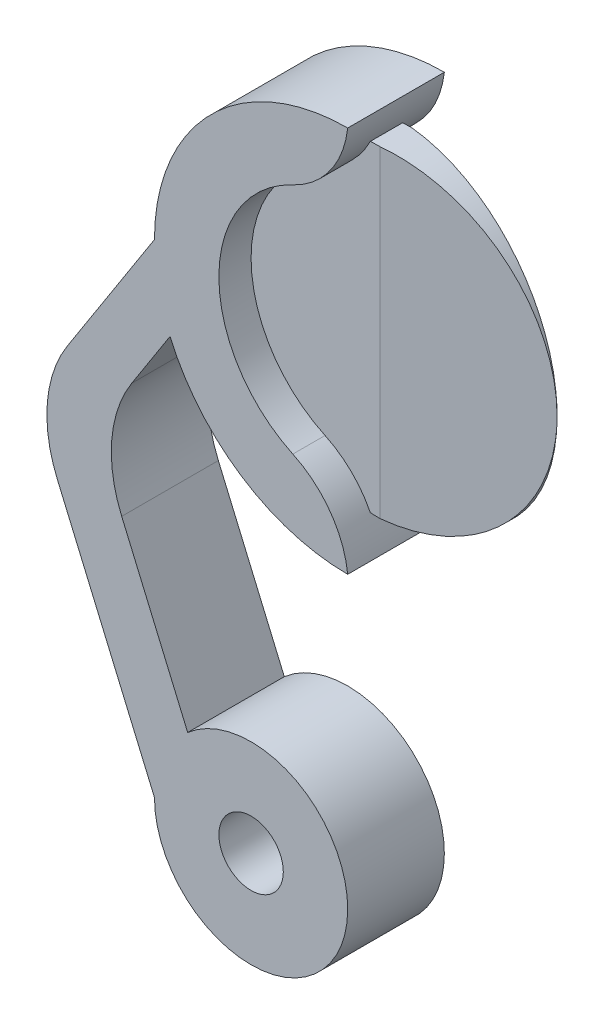
ISO-10303-21;
HEADER;
FILE_DESCRIPTION(('STEP AP214'),'2;1');
FILE_NAME('part.step','',(''),(''),'','','');
FILE_SCHEMA(('AUTOMOTIVE_DESIGN { 1 0 10303 214 1 1 1 1 }'));
ENDSEC;
DATA;
#1=APPLICATION_CONTEXT('core data for automotive mechanical design processes');
#2=APPLICATION_PROTOCOL_DEFINITION('international standard','automotive_design',2000,#1);
#3=PRODUCT_CONTEXT('',#1,'mechanical');
#4=PRODUCT('Part','Part','',(#3));
#5=PRODUCT_RELATED_PRODUCT_CATEGORY('part','',(#4));
#6=PRODUCT_DEFINITION_FORMATION('','',#4);
#7=PRODUCT_DEFINITION_CONTEXT('part definition',#1,'design');
#8=PRODUCT_DEFINITION('design','',#6,#7);
#9=PRODUCT_DEFINITION_SHAPE('','',#8);
#10=(LENGTH_UNIT() NAMED_UNIT(*) SI_UNIT(.MILLI.,.METRE.));
#11=(NAMED_UNIT(*) PLANE_ANGLE_UNIT() SI_UNIT($,.RADIAN.));
#12=(NAMED_UNIT(*) SI_UNIT($,.STERADIAN.) SOLID_ANGLE_UNIT());
#13=UNCERTAINTY_MEASURE_WITH_UNIT(LENGTH_MEASURE(1.E-05),#10,'distance_accuracy_value','');
#14=(GEOMETRIC_REPRESENTATION_CONTEXT(3) GLOBAL_UNCERTAINTY_ASSIGNED_CONTEXT((#13)) GLOBAL_UNIT_ASSIGNED_CONTEXT((#10,
#11,#12)) REPRESENTATION_CONTEXT('',''));
#15=CARTESIAN_POINT('',(0.,0.,0.));
#16=DIRECTION('',(0.,0.,1.));
#17=DIRECTION('',(1.,0.,0.));
#18=AXIS2_PLACEMENT_3D('',#15,#16,#17);
#19=CARTESIAN_POINT('',(0.,-30.,10.));
#20=DIRECTION('',(0.,0.,-1.));
#21=DIRECTION('',(0.,1.,0.));
#22=AXIS2_PLACEMENT_3D('',#19,#20,#21);
#23=CYLINDRICAL_SURFACE('',#22,25.);
#24=CARTESIAN_POINT('',(0.,-30.,5.));
#25=DIRECTION('',(0.099503719020999,0.,-0.995037190209989));
#26=DIRECTION('',(-0.995037190209989,0.,-0.099503719020999));
#27=AXIS2_PLACEMENT_3D('',#24,#25,#26);
#28=ELLIPSE('',#27,25.1246890528022,25.);
#29=CARTESIAN_POINT('',(0.,-55.,5.));
#30=VERTEX_POINT('',#29);
#31=CARTESIAN_POINT('',(25.,-30.,7.5));
#32=VERTEX_POINT('',#31);
#33=EDGE_CURVE('E12',#30,#32,#28,.F.);
#34=ORIENTED_EDGE('',*,*,#33,.T.);
#35=CARTESIAN_POINT('',(0.,-30.,10.));
#36=DIRECTION('',(0.0995037190209988,0.,0.995037190209989));
#37=DIRECTION('',(0.995037190209989,0.,-0.0995037190209988));
#38=AXIS2_PLACEMENT_3D('',#35,#36,#37);
#39=ELLIPSE('',#38,25.1246890528022,25.);
#40=CARTESIAN_POINT('',(0.,-55.,9.99999999999999));
#41=VERTEX_POINT('',#40);
#42=EDGE_CURVE('E239',#32,#41,#39,.F.);
#43=ORIENTED_EDGE('',*,*,#42,.T.);
#44=CARTESIAN_POINT('',(0.,-30.,10.));
#45=DIRECTION('',(0.,0.,-1.));
#46=DIRECTION('',(0.,1.,0.));
#47=AXIS2_PLACEMENT_3D('',#44,#45,#46);
#48=CIRCLE('',#47,25.);
#49=CARTESIAN_POINT('',(-1.492231190354,-54.9554251832048,9.99999999999999));
#50=VERTEX_POINT('',#49);
#51=EDGE_CURVE('E268',#41,#50,#48,.T.);
#52=ORIENTED_EDGE('',*,*,#51,.T.);
#53=DIRECTION('',(0.,0.,-1.));
#54=VECTOR('',#53,1.);
#55=CARTESIAN_POINT('',(-1.492231190354,-54.9554251832048,9.99999999999999));
#56=LINE('',#55,#54);
#57=CARTESIAN_POINT('',(-1.492231190354,-54.9554251832048,5.));
#58=VERTEX_POINT('',#57);
#59=EDGE_CURVE('E263',#50,#58,#56,.T.);
#60=ORIENTED_EDGE('',*,*,#59,.T.);
#61=CARTESIAN_POINT('',(0.,-30.,5.));
#62=DIRECTION('',(0.,0.,-1.));
#63=DIRECTION('',(0.,1.,0.));
#64=AXIS2_PLACEMENT_3D('',#61,#62,#63);
#65=CIRCLE('',#64,25.);
#66=EDGE_CURVE('E261',#30,#58,#65,.T.);
#67=ORIENTED_EDGE('',*,*,#66,.F.);
#68=EDGE_LOOP('',(#34,#43,#52,#60,#67));
#69=FACE_BOUND('',#68,.T.);
#70=ADVANCED_FACE('F100',(#69),#23,.T.);
#71=CARTESIAN_POINT('',(-1.492231190354,-5.04457481679515,10.));
#72=VERTEX_POINT('',#71);
#73=CARTESIAN_POINT('',(0.,-5.,10.));
#74=VERTEX_POINT('',#73);
#75=EDGE_CURVE('E253',#72,#74,#48,.T.);
#76=ORIENTED_EDGE('',*,*,#75,.T.);
#77=EDGE_CURVE('E115',#74,#32,#39,.F.);
#78=ORIENTED_EDGE('',*,*,#77,.T.);
#79=CARTESIAN_POINT('',(0.,-5.,5.));
#80=VERTEX_POINT('',#79);
#81=EDGE_CURVE('E108',#32,#80,#28,.F.);
#82=ORIENTED_EDGE('',*,*,#81,.T.);
#83=CARTESIAN_POINT('',(-1.492231190354,-5.04457481679515,5.));
#84=VERTEX_POINT('',#83);
#85=EDGE_CURVE('E266',#84,#80,#65,.T.);
#86=ORIENTED_EDGE('',*,*,#85,.F.);
#87=DIRECTION('',(0.,0.,-1.));
#88=VECTOR('',#87,1.);
#89=CARTESIAN_POINT('',(-1.492231190354,-5.04457481679515,10.));
#90=LINE('',#89,#88);
#91=EDGE_CURVE('E272',#72,#84,#90,.T.);
#92=ORIENTED_EDGE('',*,*,#91,.F.);
#93=EDGE_LOOP('',(#76,#78,#82,#86,#92));
#94=FACE_BOUND('',#93,.T.);
#95=ADVANCED_FACE('F249',(#94),#23,.T.);
#96=CARTESIAN_POINT('',(-21.,0.,10.));
#97=DIRECTION('',(0.,0.,1.));
#98=DIRECTION('',(0.,-1.,0.));
#99=AXIS2_PLACEMENT_3D('',#96,#97,#98);
#100=PLANE('',#99);
#101=ORIENTED_EDGE('',*,*,#51,.F.);
#102=DIRECTION('',(0.,1.,0.));
#103=VECTOR('',#102,1.);
#104=CARTESIAN_POINT('',(0.,-62.,9.99999999999999));
#105=LINE('',#104,#103);
#106=EDGE_CURVE('E241',#41,#74,#105,.T.);
#107=ORIENTED_EDGE('',*,*,#106,.T.);
#108=ORIENTED_EDGE('',*,*,#75,.F.);
#109=CARTESIAN_POINT('',(-14.9071198499986,1.66666666666667,10.));
#110=DIRECTION('',(0.,0.,1.));
#111=DIRECTION('',(0.,-1.,0.));
#112=AXIS2_PLACEMENT_3D('',#109,#110,#111);
#113=CIRCLE('',#112,15.);
#114=CARTESIAN_POINT('',(-8.5183541999992,-11.9047619047619,10.));
#115=VERTEX_POINT('',#114);
#116=EDGE_CURVE('E258',#72,#115,#113,.F.);
#117=ORIENTED_EDGE('',*,*,#116,.T.);
#118=CARTESIAN_POINT('',(0.,-30.,10.));
#119=DIRECTION('',(0.,0.,1.));
#120=DIRECTION('',(0.,-1.,0.));
#121=AXIS2_PLACEMENT_3D('',#118,#119,#120);
#122=CIRCLE('',#121,20.);
#123=CARTESIAN_POINT('',(-8.5183541999992,-48.0952380952381,9.99999999999999));
#124=VERTEX_POINT('',#123);
#125=EDGE_CURVE('E279',#115,#124,#122,.T.);
#126=ORIENTED_EDGE('',*,*,#125,.T.);
#127=CARTESIAN_POINT('',(-14.9071198499986,-61.6666666666667,9.99999999999999));
#128=DIRECTION('',(0.,0.,1.));
#129=DIRECTION('',(0.,-1.,0.));
#130=AXIS2_PLACEMENT_3D('',#127,#128,#129);
#131=CIRCLE('',#130,15.);
#132=EDGE_CURVE('E282',#124,#50,#131,.F.);
#133=ORIENTED_EDGE('',*,*,#132,.T.);
#134=EDGE_LOOP('',(#101,#107,#108,#117,#126,#133));
#135=FACE_BOUND('',#134,.T.);
#136=ADVANCED_FACE('F393',(#135),#100,.T.);
#137=CARTESIAN_POINT('',(-21.,0.,5.));
#138=DIRECTION('',(0.,0.,-1.));
#139=DIRECTION('',(0.,1.,0.));
#140=AXIS2_PLACEMENT_3D('',#137,#138,#139);
#141=PLANE('',#140);
#142=ORIENTED_EDGE('',*,*,#85,.T.);
#143=DIRECTION('',(0.,1.,0.));
#144=VECTOR('',#143,1.);
#145=CARTESIAN_POINT('',(0.,-62.,5.));
#146=LINE('',#145,#144);
#147=EDGE_CURVE('E244',#30,#80,#146,.T.);
#148=ORIENTED_EDGE('',*,*,#147,.F.);
#149=ORIENTED_EDGE('',*,*,#66,.T.);
#150=CARTESIAN_POINT('',(-14.9071198499986,-61.6666666666667,4.99999999999999));
#151=DIRECTION('',(0.,0.,-1.));
#152=DIRECTION('',(0.,1.,0.));
#153=AXIS2_PLACEMENT_3D('',#150,#151,#152);
#154=CIRCLE('',#153,15.);
#155=CARTESIAN_POINT('',(-8.5183541999992,-48.0952380952381,5.));
#156=VERTEX_POINT('',#155);
#157=EDGE_CURVE('E277',#58,#156,#154,.F.);
#158=ORIENTED_EDGE('',*,*,#157,.T.);
#159=CARTESIAN_POINT('',(0.,-30.,5.));
#160=DIRECTION('',(0.,0.,-1.));
#161=DIRECTION('',(0.,1.,0.));
#162=AXIS2_PLACEMENT_3D('',#159,#160,#161);
#163=CIRCLE('',#162,20.);
#164=CARTESIAN_POINT('',(-8.5183541999992,-11.9047619047619,5.));
#165=VERTEX_POINT('',#164);
#166=EDGE_CURVE('E274',#156,#165,#163,.T.);
#167=ORIENTED_EDGE('',*,*,#166,.T.);
#168=CARTESIAN_POINT('',(-14.9071198499986,1.66666666666667,5.));
#169=DIRECTION('',(0.,0.,-1.));
#170=DIRECTION('',(0.,1.,0.));
#171=AXIS2_PLACEMENT_3D('',#168,#169,#170);
#172=CIRCLE('',#171,15.);
#173=EDGE_CURVE('E388',#165,#84,#172,.F.);
#174=ORIENTED_EDGE('',*,*,#173,.T.);
#175=EDGE_LOOP('',(#142,#148,#149,#158,#167,#174));
#176=FACE_BOUND('',#175,.T.);
#177=ADVANCED_FACE('F451',(#176),#141,.T.);
#178=CARTESIAN_POINT('',(0.,-30.,15.));
#179=DIRECTION('',(0.,0.,-1.));
#180=DIRECTION('',(-1.,0.,0.));
#181=AXIS2_PLACEMENT_3D('',#178,#179,#180);
#182=CYLINDRICAL_SURFACE('',#181,20.);
#183=ORIENTED_EDGE('',*,*,#125,.F.);
#184=DIRECTION('',(0.,0.,-1.));
#185=VECTOR('',#184,1.);
#186=CARTESIAN_POINT('',(-8.5183541999992,-11.9047619047619,15.));
#187=LINE('',#186,#185);
#188=CARTESIAN_POINT('',(-8.5183541999992,-11.9047619047619,15.));
#189=VERTEX_POINT('',#188);
#190=EDGE_CURVE('E371',#115,#189,#187,.F.);
#191=ORIENTED_EDGE('',*,*,#190,.T.);
#192=CARTESIAN_POINT('',(0.,-30.,15.));
#193=DIRECTION('',(0.,0.,1.));
#194=DIRECTION('',(1.,0.,0.));
#195=AXIS2_PLACEMENT_3D('',#192,#193,#194);
#196=CIRCLE('',#195,20.);
#197=CARTESIAN_POINT('',(-8.5183541999992,-48.0952380952381,15.));
#198=VERTEX_POINT('',#197);
#199=EDGE_CURVE('E289',#189,#198,#196,.T.);
#200=ORIENTED_EDGE('',*,*,#199,.T.);
#201=DIRECTION('',(0.,0.,-1.));
#202=VECTOR('',#201,1.);
#203=CARTESIAN_POINT('',(-8.5183541999992,-48.0952380952381,15.));
#204=LINE('',#203,#202);
#205=EDGE_CURVE('E376',#198,#124,#204,.T.);
#206=ORIENTED_EDGE('',*,*,#205,.T.);
#207=EDGE_LOOP('',(#183,#191,#200,#206));
#208=FACE_BOUND('',#207,.T.);
#209=ADVANCED_FACE('F397',(#208),#182,.F.);
#210=ORIENTED_EDGE('',*,*,#166,.F.);
#211=CARTESIAN_POINT('',(-8.5183541999992,-48.0952380952381,0.));
#212=VERTEX_POINT('',#211);
#213=EDGE_CURVE('E375',#156,#212,#204,.T.);
#214=ORIENTED_EDGE('',*,*,#213,.T.);
#215=CARTESIAN_POINT('',(0.,-30.,0.));
#216=DIRECTION('',(0.,0.,1.));
#217=DIRECTION('',(1.,0.,0.));
#218=AXIS2_PLACEMENT_3D('',#215,#216,#217);
#219=CIRCLE('',#218,20.);
#220=CARTESIAN_POINT('',(-8.5183541999992,-11.9047619047619,0.));
#221=VERTEX_POINT('',#220);
#222=EDGE_CURVE('E314',#221,#212,#219,.T.);
#223=ORIENTED_EDGE('',*,*,#222,.F.);
#224=EDGE_CURVE('E372',#221,#165,#187,.F.);
#225=ORIENTED_EDGE('',*,*,#224,.T.);
#226=EDGE_LOOP('',(#210,#214,#223,#225));
#227=FACE_BOUND('',#226,.T.);
#228=ADVANCED_FACE('F453',(#227),#182,.F.);
#229=CARTESIAN_POINT('',(0.,-30.,15.));
#230=DIRECTION('',(0.,0.,-1.));
#231=DIRECTION('',(-1.,0.,0.));
#232=AXIS2_PLACEMENT_3D('',#229,#230,#231);
#233=CYLINDRICAL_SURFACE('',#232,30.);
#234=DIRECTION('',(0.,0.,-1.));
#235=VECTOR('',#234,1.);
#236=CARTESIAN_POINT('',(0.,0.,15.));
#237=LINE('',#236,#235);
#238=CARTESIAN_POINT('',(0.,0.,15.));
#239=VERTEX_POINT('',#238);
#240=CARTESIAN_POINT('',(0.,0.,10.));
#241=VERTEX_POINT('',#240);
#242=EDGE_CURVE('E349',#239,#241,#237,.T.);
#243=ORIENTED_EDGE('',*,*,#242,.T.);
#244=CARTESIAN_POINT('',(0.,0.,5.));
#245=VERTEX_POINT('',#244);
#246=EDGE_CURVE('E353',#241,#245,#237,.T.);
#247=ORIENTED_EDGE('',*,*,#246,.T.);
#248=CARTESIAN_POINT('',(0.,0.,0.));
#249=VERTEX_POINT('',#248);
#250=EDGE_CURVE('E348',#245,#249,#237,.T.);
#251=ORIENTED_EDGE('',*,*,#250,.T.);
#252=CARTESIAN_POINT('',(0.,-30.,0.));
#253=DIRECTION('',(0.,0.,1.));
#254=DIRECTION('',(1.,0.,0.));
#255=AXIS2_PLACEMENT_3D('',#252,#253,#254);
#256=CIRCLE('',#255,30.);
#257=CARTESIAN_POINT('',(-30.,-30.,0.));
#258=VERTEX_POINT('',#257);
#259=EDGE_CURVE('E317',#249,#258,#256,.T.);
#260=ORIENTED_EDGE('',*,*,#259,.T.);
#261=DIRECTION('',(0.,0.,-1.));
#262=VECTOR('',#261,1.);
#263=CARTESIAN_POINT('',(-30.,-30.,15.));
#264=LINE('',#263,#262);
#265=CARTESIAN_POINT('',(-30.,-30.,15.));
#266=VERTEX_POINT('',#265);
#267=EDGE_CURVE('E345',#266,#258,#264,.T.);
#268=ORIENTED_EDGE('',*,*,#267,.F.);
#269=CARTESIAN_POINT('',(0.,-30.,15.));
#270=DIRECTION('',(0.,0.,1.));
#271=DIRECTION('',(1.,0.,0.));
#272=AXIS2_PLACEMENT_3D('',#269,#270,#271);
#273=CIRCLE('',#272,30.);
#274=EDGE_CURVE('E293',#239,#266,#273,.T.);
#275=ORIENTED_EDGE('',*,*,#274,.F.);
#276=EDGE_LOOP('',(#243,#247,#251,#260,#268,#275));
#277=FACE_BOUND('',#276,.T.);
#278=ADVANCED_FACE('F407',(#277),#233,.T.);
#279=CARTESIAN_POINT('',(-7.61037112589277,4.88450112783725,15.));
#280=DIRECTION('',(0.841574637744924,-0.540140841914865,0.));
#281=DIRECTION('',(0.540140841914866,0.841574637744924,0.));
#282=AXIS2_PLACEMENT_3D('',#279,#280,#281);
#283=PLANE('',#282);
#284=DIRECTION('',(-0.540140841914866,-0.841574637744924,0.));
#285=VECTOR('',#284,1.);
#286=CARTESIAN_POINT('',(-7.61037112589277,4.88450112783725,0.));
#287=LINE('',#286,#285);
#288=CARTESIAN_POINT('',(-43.5278029245234,-51.0771986901241,0.));
#289=VERTEX_POINT('',#288);
#290=EDGE_CURVE('E320',#258,#289,#287,.T.);
#291=ORIENTED_EDGE('',*,*,#290,.T.);
#292=DIRECTION('',(0.,0.,-1.));
#293=VECTOR('',#292,1.);
#294=CARTESIAN_POINT('',(-43.5278029245234,-51.0771986901241,15.));
#295=LINE('',#294,#293);
#296=CARTESIAN_POINT('',(-43.5278029245234,-51.0771986901241,15.));
#297=VERTEX_POINT('',#296);
#298=EDGE_CURVE('E363',#289,#297,#295,.F.);
#299=ORIENTED_EDGE('',*,*,#298,.T.);
#300=DIRECTION('',(-0.540140841914866,-0.841574637744924,0.));
#301=VECTOR('',#300,1.);
#302=CARTESIAN_POINT('',(-7.61037112589277,4.88450112783725,15.));
#303=LINE('',#302,#301);
#304=EDGE_CURVE('E296',#266,#297,#303,.T.);
#305=ORIENTED_EDGE('',*,*,#304,.F.);
#306=ORIENTED_EDGE('',*,*,#267,.T.);
#307=EDGE_LOOP('',(#291,#299,#305,#306));
#308=FACE_BOUND('',#307,.T.);
#309=ADVANCED_FACE('F410',(#308),#283,.F.);
#310=CARTESIAN_POINT('',(-63.3324666824997,-27.0987664790654,15.));
#311=DIRECTION('',(0.919374663063813,0.393383056214041,0.));
#312=DIRECTION('',(-0.393383056214041,0.919374663063813,0.));
#313=AXIS2_PLACEMENT_3D('',#310,#311,#312);
#314=PLANE('',#313);
#315=DIRECTION('',(0.393383056214041,-0.919374663063813,0.));
#316=VECTOR('',#315,1.);
#317=CARTESIAN_POINT('',(-63.3324666824997,-27.0987664790654,15.));
#318=LINE('',#317,#316);
#319=CARTESIAN_POINT('',(-45.0838034309012,-69.7476766527022,15.));
#320=VERTEX_POINT('',#319);
#321=CARTESIAN_POINT('',(-30.,-105.,15.));
#322=VERTEX_POINT('',#321);
#323=EDGE_CURVE('E299',#320,#322,#318,.T.);
#324=ORIENTED_EDGE('',*,*,#323,.F.);
#325=DIRECTION('',(0.,0.,-1.));
#326=VECTOR('',#325,1.);
#327=CARTESIAN_POINT('',(-45.0838034309012,-69.7476766527022,15.));
#328=LINE('',#327,#326);
#329=CARTESIAN_POINT('',(-45.0838034309012,-69.7476766527022,0.));
#330=VERTEX_POINT('',#329);
#331=EDGE_CURVE('E358',#320,#330,#328,.T.);
#332=ORIENTED_EDGE('',*,*,#331,.T.);
#333=DIRECTION('',(0.393383056214041,-0.919374663063813,0.));
#334=VECTOR('',#333,1.);
#335=CARTESIAN_POINT('',(-63.3324666824997,-27.0987664790654,0.));
#336=LINE('',#335,#334);
#337=CARTESIAN_POINT('',(-30.,-105.,0.));
#338=VERTEX_POINT('',#337);
#339=EDGE_CURVE('E323',#330,#338,#336,.T.);
#340=ORIENTED_EDGE('',*,*,#339,.T.);
#341=DIRECTION('',(0.,0.,-1.));
#342=VECTOR('',#341,1.);
#343=CARTESIAN_POINT('',(-30.,-105.,15.));
#344=LINE('',#343,#342);
#345=EDGE_CURVE('E342',#322,#338,#344,.T.);
#346=ORIENTED_EDGE('',*,*,#345,.F.);
#347=EDGE_LOOP('',(#324,#332,#340,#346));
#348=FACE_BOUND('',#347,.T.);
#349=ADVANCED_FACE('F419',(#348),#314,.F.);
#350=CARTESIAN_POINT('',(-15.,-105.,15.));
#351=DIRECTION('',(0.,0.,-1.));
#352=DIRECTION('',(-1.,0.,0.));
#353=AXIS2_PLACEMENT_3D('',#350,#351,#352);
#354=CYLINDRICAL_SURFACE('',#353,15.);
#355=CARTESIAN_POINT('',(-15.,-105.,0.));
#356=DIRECTION('',(0.,0.,1.));
#357=DIRECTION('',(1.,0.,0.));
#358=AXIS2_PLACEMENT_3D('',#355,#356,#357);
#359=CIRCLE('',#358,15.);
#360=CARTESIAN_POINT('',(-24.843075060403,-93.6812600809423,0.));
#361=VERTEX_POINT('',#360);
#362=EDGE_CURVE('E325',#338,#361,#359,.T.);
#363=ORIENTED_EDGE('',*,*,#362,.T.);
#364=DIRECTION('',(0.,0.,-1.));
#365=VECTOR('',#364,1.);
#366=CARTESIAN_POINT('',(-24.843075060403,-93.6812600809423,15.));
#367=LINE('',#366,#365);
#368=CARTESIAN_POINT('',(-24.843075060403,-93.6812600809423,15.));
#369=VERTEX_POINT('',#368);
#370=EDGE_CURVE('E339',#369,#361,#367,.T.);
#371=ORIENTED_EDGE('',*,*,#370,.F.);
#372=CARTESIAN_POINT('',(-15.,-105.,15.));
#373=DIRECTION('',(0.,0.,1.));
#374=DIRECTION('',(1.,0.,0.));
#375=AXIS2_PLACEMENT_3D('',#372,#373,#374);
#376=CIRCLE('',#375,15.);
#377=EDGE_CURVE('E301',#322,#369,#376,.T.);
#378=ORIENTED_EDGE('',*,*,#377,.F.);
#379=ORIENTED_EDGE('',*,*,#345,.T.);
#380=EDGE_LOOP('',(#363,#371,#378,#379));
#381=FACE_BOUND('',#380,.T.);
#382=ADVANCED_FACE('F428',(#381),#354,.T.);
#383=CARTESIAN_POINT('',(-54.8799689716627,-23.4821023314474,15.));
#384=DIRECTION('',(0.919374663063814,0.393383056214041,0.));
#385=DIRECTION('',(-0.393383056214041,0.919374663063814,0.));
#386=AXIS2_PLACEMENT_3D('',#383,#384,#385);
#387=PLANE('',#386);
#388=DIRECTION('',(0.393383056214041,-0.919374663063814,0.));
#389=VECTOR('',#388,1.);
#390=CARTESIAN_POINT('',(-54.8799689716627,-23.4821023314474,0.));
#391=LINE('',#390,#389);
#392=CARTESIAN_POINT('',(-35.0838034309012,-69.7476766527022,0.));
#393=VERTEX_POINT('',#392);
#394=EDGE_CURVE('E328',#393,#361,#391,.T.);
#395=ORIENTED_EDGE('',*,*,#394,.F.);
#396=DIRECTION('',(0.,0.,-1.));
#397=VECTOR('',#396,1.);
#398=CARTESIAN_POINT('',(-35.0838034309012,-69.7476766527022,15.));
#399=LINE('',#398,#397);
#400=CARTESIAN_POINT('',(-35.0838034309012,-69.7476766527022,15.));
#401=VERTEX_POINT('',#400);
#402=EDGE_CURVE('E356',#393,#401,#399,.F.);
#403=ORIENTED_EDGE('',*,*,#402,.T.);
#404=DIRECTION('',(0.393383056214041,-0.919374663063814,0.));
#405=VECTOR('',#404,1.);
#406=CARTESIAN_POINT('',(-54.8799689716627,-23.4821023314474,15.));
#407=LINE('',#406,#405);
#408=EDGE_CURVE('E304',#401,#369,#407,.T.);
#409=ORIENTED_EDGE('',*,*,#408,.T.);
#410=ORIENTED_EDGE('',*,*,#370,.T.);
#411=EDGE_LOOP('',(#395,#403,#409,#410));
#412=FACE_BOUND('',#411,.T.);
#413=ADVANCED_FACE('F489',(#412),#387,.T.);
#414=CARTESIAN_POINT('',(-0.52789241693777,0.338812794179835,15.));
#415=DIRECTION('',(0.841574637744924,-0.540140841914865,0.));
#416=DIRECTION('',(0.540140841914865,0.841574637744924,0.));
#417=AXIS2_PLACEMENT_3D('',#414,#415,#416);
#418=PLANE('',#417);
#419=DIRECTION('',(-0.540140841914866,-0.841574637744924,0.));
#420=VECTOR('',#419,1.);
#421=CARTESIAN_POINT('',(-0.52789241693777,0.338812794179835,15.));
#422=LINE('',#421,#420);
#423=CARTESIAN_POINT('',(-27.5785246722631,-41.8078354028745,15.));
#424=VERTEX_POINT('',#423);
#425=CARTESIAN_POINT('',(-33.5278029245234,-51.0771986901241,15.));
#426=VERTEX_POINT('',#425);
#427=EDGE_CURVE('E306',#424,#426,#422,.T.);
#428=ORIENTED_EDGE('',*,*,#427,.T.);
#429=DIRECTION('',(0.,0.,-1.));
#430=VECTOR('',#429,1.);
#431=CARTESIAN_POINT('',(-33.5278029245234,-51.0771986901241,0.));
#432=LINE('',#431,#430);
#433=CARTESIAN_POINT('',(-33.5278029245234,-51.0771986901241,0.));
#434=VERTEX_POINT('',#433);
#435=EDGE_CURVE('E352',#426,#434,#432,.T.);
#436=ORIENTED_EDGE('',*,*,#435,.T.);
#437=DIRECTION('',(-0.540140841914866,-0.841574637744924,0.));
#438=VECTOR('',#437,1.);
#439=CARTESIAN_POINT('',(-0.52789241693777,0.338812794179835,0.));
#440=LINE('',#439,#438);
#441=CARTESIAN_POINT('',(-27.5785246722631,-41.8078354028745,0.));
#442=VERTEX_POINT('',#441);
#443=EDGE_CURVE('E330',#442,#434,#440,.T.);
#444=ORIENTED_EDGE('',*,*,#443,.F.);
#445=DIRECTION('',(0.,0.,-1.));
#446=VECTOR('',#445,1.);
#447=CARTESIAN_POINT('',(-27.5785246722631,-41.8078354028745,15.));
#448=LINE('',#447,#446);
#449=EDGE_CURVE('E337',#424,#442,#448,.T.);
#450=ORIENTED_EDGE('',*,*,#449,.F.);
#451=EDGE_LOOP('',(#428,#436,#444,#450));
#452=FACE_BOUND('',#451,.T.);
#453=ADVANCED_FACE('F439',(#452),#418,.T.);
#454=CARTESIAN_POINT('',(0.,-30.,15.));
#455=DIRECTION('',(0.,0.,-1.));
#456=DIRECTION('',(-1.,0.,0.));
#457=AXIS2_PLACEMENT_3D('',#454,#455,#456);
#458=CYLINDRICAL_SURFACE('',#457,30.);
#459=CARTESIAN_POINT('',(0.,-30.,0.));
#460=DIRECTION('',(0.,0.,1.));
#461=DIRECTION('',(1.,0.,0.));
#462=AXIS2_PLACEMENT_3D('',#459,#460,#461);
#463=CIRCLE('',#462,30.);
#464=CARTESIAN_POINT('',(0.,-60.,0.));
#465=VERTEX_POINT('',#464);
#466=EDGE_CURVE('E290',#442,#465,#463,.T.);
#467=ORIENTED_EDGE('',*,*,#466,.T.);
#468=DIRECTION('',(0.,0.,-1.));
#469=VECTOR('',#468,1.);
#470=CARTESIAN_POINT('',(0.,-60.,15.));
#471=LINE('',#470,#469);
#472=CARTESIAN_POINT('',(0.,-60.,4.99999999999999));
#473=VERTEX_POINT('',#472);
#474=EDGE_CURVE('E311',#473,#465,#471,.T.);
#475=ORIENTED_EDGE('',*,*,#474,.F.);
#476=CARTESIAN_POINT('',(0.,-60.,9.99999999999999));
#477=VERTEX_POINT('',#476);
#478=EDGE_CURVE('E123',#477,#473,#471,.T.);
#479=ORIENTED_EDGE('',*,*,#478,.F.);
#480=CARTESIAN_POINT('',(0.,-60.,15.));
#481=VERTEX_POINT('',#480);
#482=EDGE_CURVE('E335',#481,#477,#471,.T.);
#483=ORIENTED_EDGE('',*,*,#482,.F.);
#484=CARTESIAN_POINT('',(0.,-30.,15.));
#485=DIRECTION('',(0.,0.,1.));
#486=DIRECTION('',(1.,0.,0.));
#487=AXIS2_PLACEMENT_3D('',#484,#485,#486);
#488=CIRCLE('',#487,30.);
#489=EDGE_CURVE('E309',#424,#481,#488,.T.);
#490=ORIENTED_EDGE('',*,*,#489,.F.);
#491=ORIENTED_EDGE('',*,*,#449,.T.);
#492=EDGE_LOOP('',(#467,#475,#479,#483,#490,#491));
#493=FACE_BOUND('',#492,.T.);
#494=ADVANCED_FACE('F442',(#493),#458,.T.);
#495=CARTESIAN_POINT('',(-15.,-105.,15.));
#496=DIRECTION('',(0.,0.,-1.));
#497=DIRECTION('',(-1.,0.,0.));
#498=AXIS2_PLACEMENT_3D('',#495,#496,#497);
#499=CYLINDRICAL_SURFACE('',#498,5.);
#500=CARTESIAN_POINT('',(-15.,-105.,15.));
#501=DIRECTION('',(0.,0.,1.));
#502=DIRECTION('',(1.,0.,0.));
#503=AXIS2_PLACEMENT_3D('',#500,#501,#502);
#504=CIRCLE('',#503,5.);
#505=CARTESIAN_POINT('',(-9.99999999999999,-105.,15.));
#506=VERTEX_POINT('',#505);
#507=EDGE_CURVE('E286',#506,#506,#504,.T.);
#508=ORIENTED_EDGE('',*,*,#507,.T.);
#509=EDGE_LOOP('',(#508));
#510=FACE_BOUND('',#509,.T.);
#511=CARTESIAN_POINT('',(-15.,-105.,0.));
#512=DIRECTION('',(0.,0.,1.));
#513=DIRECTION('',(1.,0.,0.));
#514=AXIS2_PLACEMENT_3D('',#511,#512,#513);
#515=CIRCLE('',#514,5.);
#516=CARTESIAN_POINT('',(-9.99999999999999,-105.,0.));
#517=VERTEX_POINT('',#516);
#518=EDGE_CURVE('E285',#517,#517,#515,.T.);
#519=ORIENTED_EDGE('',*,*,#518,.F.);
#520=EDGE_LOOP('',(#519));
#521=FACE_BOUND('',#520,.T.);
#522=ADVANCED_FACE('F480',(#510,#521),#499,.F.);
#523=CARTESIAN_POINT('',(0.,0.,15.));
#524=DIRECTION('',(0.,0.,1.));
#525=DIRECTION('',(1.,0.,0.));
#526=AXIS2_PLACEMENT_3D('',#523,#524,#525);
#527=PLANE('',#526);
#528=ORIENTED_EDGE('',*,*,#507,.F.);
#529=EDGE_LOOP('',(#528));
#530=FACE_BOUND('',#529,.T.);
#531=ORIENTED_EDGE('',*,*,#489,.T.);
#532=CARTESIAN_POINT('',(-14.9071198499986,-61.6666666666667,15.));
#533=DIRECTION('',(0.,0.,1.));
#534=DIRECTION('',(1.,0.,0.));
#535=AXIS2_PLACEMENT_3D('',#532,#533,#534);
#536=CIRCLE('',#535,15.);
#537=EDGE_CURVE('E386',#481,#198,#536,.T.);
#538=ORIENTED_EDGE('',*,*,#537,.T.);
#539=ORIENTED_EDGE('',*,*,#199,.F.);
#540=CARTESIAN_POINT('',(-14.9071198499986,1.66666666666667,15.));
#541=DIRECTION('',(0.,0.,1.));
#542=DIRECTION('',(1.,0.,0.));
#543=AXIS2_PLACEMENT_3D('',#540,#541,#542);
#544=CIRCLE('',#543,15.);
#545=EDGE_CURVE('E384',#189,#239,#544,.T.);
#546=ORIENTED_EDGE('',*,*,#545,.T.);
#547=ORIENTED_EDGE('',*,*,#274,.T.);
#548=ORIENTED_EDGE('',*,*,#304,.T.);
#549=CARTESIAN_POINT('',(-26.6963101696249,-61.8800155284214,15.));
#550=DIRECTION('',(0.,0.,1.));
#551=DIRECTION('',(1.,0.,0.));
#552=AXIS2_PLACEMENT_3D('',#549,#550,#551);
#553=CIRCLE('',#552,20.);
#554=EDGE_CURVE('E365',#297,#320,#553,.T.);
#555=ORIENTED_EDGE('',*,*,#554,.T.);
#556=ORIENTED_EDGE('',*,*,#323,.T.);
#557=ORIENTED_EDGE('',*,*,#377,.T.);
#558=ORIENTED_EDGE('',*,*,#408,.F.);
#559=CARTESIAN_POINT('',(-16.6963101696249,-61.8800155284214,15.));
#560=DIRECTION('',(0.,0.,1.));
#561=DIRECTION('',(1.,0.,0.));
#562=AXIS2_PLACEMENT_3D('',#559,#560,#561);
#563=CIRCLE('',#562,20.);
#564=EDGE_CURVE('E369',#401,#426,#563,.F.);
#565=ORIENTED_EDGE('',*,*,#564,.T.);
#566=ORIENTED_EDGE('',*,*,#427,.F.);
#567=EDGE_LOOP('',(#531,#538,#539,#546,#547,#548,#555,#556,#557,#558,#565,#566));
#568=FACE_BOUND('',#567,.T.);
#569=ADVANCED_FACE('F404',(#530,#568),#527,.T.);
#570=CARTESIAN_POINT('',(0.,0.,0.));
#571=DIRECTION('',(0.,0.,1.));
#572=DIRECTION('',(1.,0.,0.));
#573=AXIS2_PLACEMENT_3D('',#570,#571,#572);
#574=PLANE('',#573);
#575=ORIENTED_EDGE('',*,*,#518,.T.);
#576=EDGE_LOOP('',(#575));
#577=FACE_BOUND('',#576,.T.);
#578=ORIENTED_EDGE('',*,*,#222,.T.);
#579=CARTESIAN_POINT('',(-14.9071198499986,-61.6666666666667,0.));
#580=DIRECTION('',(0.,0.,1.));
#581=DIRECTION('',(1.,0.,0.));
#582=AXIS2_PLACEMENT_3D('',#579,#580,#581);
#583=CIRCLE('',#582,15.);
#584=EDGE_CURVE('E381',#212,#465,#583,.F.);
#585=ORIENTED_EDGE('',*,*,#584,.T.);
#586=ORIENTED_EDGE('',*,*,#466,.F.);
#587=ORIENTED_EDGE('',*,*,#443,.T.);
#588=CARTESIAN_POINT('',(-16.6963101696249,-61.8800155284214,0.));
#589=DIRECTION('',(0.,0.,1.));
#590=DIRECTION('',(1.,0.,0.));
#591=AXIS2_PLACEMENT_3D('',#588,#589,#590);
#592=CIRCLE('',#591,20.);
#593=EDGE_CURVE('E367',#434,#393,#592,.T.);
#594=ORIENTED_EDGE('',*,*,#593,.T.);
#595=ORIENTED_EDGE('',*,*,#394,.T.);
#596=ORIENTED_EDGE('',*,*,#362,.F.);
#597=ORIENTED_EDGE('',*,*,#339,.F.);
#598=CARTESIAN_POINT('',(-26.6963101696249,-61.8800155284214,0.));
#599=DIRECTION('',(0.,0.,1.));
#600=DIRECTION('',(1.,0.,0.));
#601=AXIS2_PLACEMENT_3D('',#598,#599,#600);
#602=CIRCLE('',#601,20.);
#603=EDGE_CURVE('E361',#330,#289,#602,.F.);
#604=ORIENTED_EDGE('',*,*,#603,.T.);
#605=ORIENTED_EDGE('',*,*,#290,.F.);
#606=ORIENTED_EDGE('',*,*,#259,.F.);
#607=CARTESIAN_POINT('',(-14.9071198499986,1.66666666666667,0.));
#608=DIRECTION('',(0.,0.,1.));
#609=DIRECTION('',(1.,0.,0.));
#610=AXIS2_PLACEMENT_3D('',#607,#608,#609);
#611=CIRCLE('',#610,15.);
#612=EDGE_CURVE('E379',#249,#221,#611,.F.);
#613=ORIENTED_EDGE('',*,*,#612,.T.);
#614=EDGE_LOOP('',(#578,#585,#586,#587,#594,#595,#596,#597,#604,#605,#606,#613));
#615=FACE_BOUND('',#614,.T.);
#616=ADVANCED_FACE('F423',(#577,#615),#574,.F.);
#617=CARTESIAN_POINT('',(-16.6963101696249,-61.8800155284214,15.));
#618=DIRECTION('',(0.,0.,1.));
#619=DIRECTION('',(1.,0.,0.));
#620=AXIS2_PLACEMENT_3D('',#617,#618,#619);
#621=CYLINDRICAL_SURFACE('',#620,20.);
#622=ORIENTED_EDGE('',*,*,#564,.F.);
#623=ORIENTED_EDGE('',*,*,#402,.F.);
#624=ORIENTED_EDGE('',*,*,#593,.F.);
#625=ORIENTED_EDGE('',*,*,#435,.F.);
#626=EDGE_LOOP('',(#622,#623,#624,#625));
#627=FACE_BOUND('',#626,.T.);
#628=ADVANCED_FACE('F436',(#627),#621,.F.);
#629=CARTESIAN_POINT('',(-26.6963101696249,-61.8800155284214,15.));
#630=DIRECTION('',(0.,0.,-1.));
#631=DIRECTION('',(-1.,0.,0.));
#632=AXIS2_PLACEMENT_3D('',#629,#630,#631);
#633=CYLINDRICAL_SURFACE('',#632,20.);
#634=ORIENTED_EDGE('',*,*,#554,.F.);
#635=ORIENTED_EDGE('',*,*,#298,.F.);
#636=ORIENTED_EDGE('',*,*,#603,.F.);
#637=ORIENTED_EDGE('',*,*,#331,.F.);
#638=EDGE_LOOP('',(#634,#635,#636,#637));
#639=FACE_BOUND('',#638,.T.);
#640=ADVANCED_FACE('F416',(#639),#633,.T.);
#641=CARTESIAN_POINT('',(-14.9071198499986,-61.6666666666667,15.));
#642=DIRECTION('',(0.,0.,-1.));
#643=DIRECTION('',(-1.,0.,0.));
#644=AXIS2_PLACEMENT_3D('',#641,#642,#643);
#645=CYLINDRICAL_SURFACE('',#644,15.);
#646=ORIENTED_EDGE('',*,*,#157,.F.);
#647=ORIENTED_EDGE('',*,*,#59,.F.);
#648=ORIENTED_EDGE('',*,*,#132,.F.);
#649=ORIENTED_EDGE('',*,*,#205,.F.);
#650=ORIENTED_EDGE('',*,*,#537,.F.);
#651=ORIENTED_EDGE('',*,*,#482,.T.);
#652=ORIENTED_EDGE('',*,*,#478,.T.);
#653=ORIENTED_EDGE('',*,*,#474,.T.);
#654=ORIENTED_EDGE('',*,*,#584,.F.);
#655=ORIENTED_EDGE('',*,*,#213,.F.);
#656=EDGE_LOOP('',(#646,#647,#648,#649,#650,#651,#652,#653,#654,#655));
#657=FACE_BOUND('',#656,.T.);
#658=ADVANCED_FACE('F446',(#657),#645,.T.);
#659=CARTESIAN_POINT('',(-14.9071198499986,1.66666666666667,15.));
#660=DIRECTION('',(0.,0.,-1.));
#661=DIRECTION('',(-1.,0.,0.));
#662=AXIS2_PLACEMENT_3D('',#659,#660,#661);
#663=CYLINDRICAL_SURFACE('',#662,15.);
#664=ORIENTED_EDGE('',*,*,#173,.F.);
#665=ORIENTED_EDGE('',*,*,#224,.F.);
#666=ORIENTED_EDGE('',*,*,#612,.F.);
#667=ORIENTED_EDGE('',*,*,#250,.F.);
#668=ORIENTED_EDGE('',*,*,#246,.F.);
#669=ORIENTED_EDGE('',*,*,#242,.F.);
#670=ORIENTED_EDGE('',*,*,#545,.F.);
#671=ORIENTED_EDGE('',*,*,#190,.F.);
#672=ORIENTED_EDGE('',*,*,#116,.F.);
#673=ORIENTED_EDGE('',*,*,#91,.T.);
#674=EDGE_LOOP('',(#664,#665,#666,#667,#668,#669,#670,#671,#672,#673));
#675=FACE_BOUND('',#674,.T.);
#676=ADVANCED_FACE('F102',(#675),#663,.T.);
#677=CARTESIAN_POINT('',(-0.495049504950495,-62.,4.95049504950495));
#678=DIRECTION('',(0.099503719020999,0.,-0.995037190209989));
#679=DIRECTION('',(-0.995037190209989,0.,-0.099503719020999));
#680=AXIS2_PLACEMENT_3D('',#677,#678,#679);
#681=PLANE('',#680);
#682=ORIENTED_EDGE('',*,*,#147,.T.);
#683=ORIENTED_EDGE('',*,*,#81,.F.);
#684=ORIENTED_EDGE('',*,*,#33,.F.);
#685=EDGE_LOOP('',(#682,#683,#684));
#686=FACE_BOUND('',#685,.T.);
#687=ADVANCED_FACE('F255',(#686),#681,.T.);
#688=CARTESIAN_POINT('',(0.990099009900988,-62.,9.9009900990099));
#689=DIRECTION('',(0.0995037190209988,0.,0.995037190209989));
#690=DIRECTION('',(0.995037190209989,0.,-0.0995037190209988));
#691=AXIS2_PLACEMENT_3D('',#688,#689,#690);
#692=PLANE('',#691);
#693=ORIENTED_EDGE('',*,*,#77,.F.);
#694=ORIENTED_EDGE('',*,*,#106,.F.);
#695=ORIENTED_EDGE('',*,*,#42,.F.);
#696=EDGE_LOOP('',(#693,#694,#695));
#697=FACE_BOUND('',#696,.T.);
#698=ADVANCED_FACE('F240',(#697),#692,.T.);
#699=CLOSED_SHELL('',(#70,#95,#136,#177,#209,#228,#278,#309,#349,#382,#413,#453,#494,#522,#569,
#616,#628,#640,#658,#676,#687,#698));
#700=MANIFOLD_SOLID_BREP('B2',#699);
#701=ADVANCED_BREP_SHAPE_REPRESENTATION('',(#18,#700),#14);
#702=SHAPE_DEFINITION_REPRESENTATION(#9,#701);
ENDSEC;
END-ISO-10303-21;
